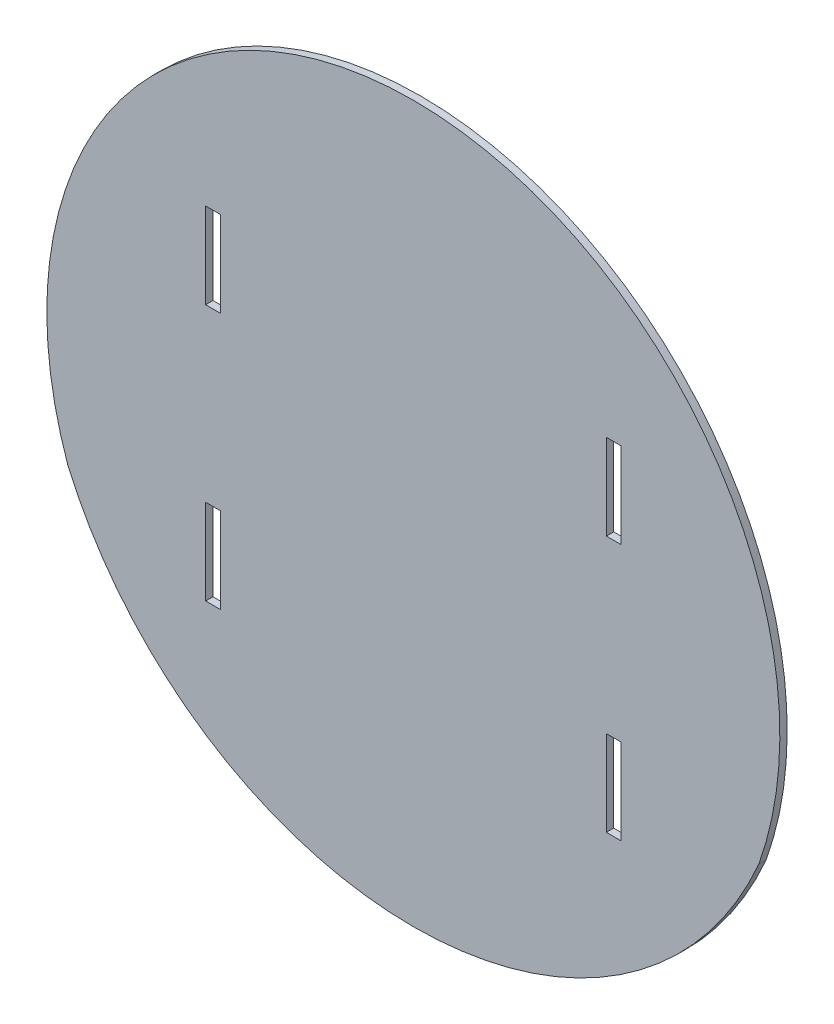
ISO-10303-21;
HEADER;
FILE_DESCRIPTION(('STEP AP214'),'2;1');
FILE_NAME('part.step','',(''),(''),'','','');
FILE_SCHEMA(('AUTOMOTIVE_DESIGN { 1 0 10303 214 1 1 1 1 }'));
ENDSEC;
DATA;
#1=APPLICATION_CONTEXT('core data for automotive mechanical design processes');
#2=APPLICATION_PROTOCOL_DEFINITION('international standard','automotive_design',2000,#1);
#3=PRODUCT_CONTEXT('',#1,'mechanical');
#4=PRODUCT('Part','Part','',(#3));
#5=PRODUCT_RELATED_PRODUCT_CATEGORY('part','',(#4));
#6=PRODUCT_DEFINITION_FORMATION('','',#4);
#7=PRODUCT_DEFINITION_CONTEXT('part definition',#1,'design');
#8=PRODUCT_DEFINITION('design','',#6,#7);
#9=PRODUCT_DEFINITION_SHAPE('','',#8);
#10=(LENGTH_UNIT() NAMED_UNIT(*) SI_UNIT(.MILLI.,.METRE.));
#11=(NAMED_UNIT(*) PLANE_ANGLE_UNIT() SI_UNIT($,.RADIAN.));
#12=(NAMED_UNIT(*) SI_UNIT($,.STERADIAN.) SOLID_ANGLE_UNIT());
#13=UNCERTAINTY_MEASURE_WITH_UNIT(LENGTH_MEASURE(1.E-05),#10,'distance_accuracy_value','');
#14=(GEOMETRIC_REPRESENTATION_CONTEXT(3) GLOBAL_UNCERTAINTY_ASSIGNED_CONTEXT((#13)) GLOBAL_UNIT_ASSIGNED_CONTEXT((#10,
#11,#12)) REPRESENTATION_CONTEXT('',''));
#15=CARTESIAN_POINT('',(0.,0.,0.));
#16=DIRECTION('',(0.,0.,1.));
#17=DIRECTION('',(1.,0.,0.));
#18=AXIS2_PLACEMENT_3D('',#15,#16,#17);
#19=CARTESIAN_POINT('',(0.,5.54868131109093,3.));
#20=DIRECTION('',(0.,0.,-1.));
#21=DIRECTION('',(-1.,0.,0.));
#22=AXIS2_PLACEMENT_3D('',#19,#20,#21);
#23=PLANE('',#22);
#24=DIRECTION('',(0.,1.,0.));
#25=VECTOR('',#24,1.);
#26=CARTESIAN_POINT('',(85.0000000000001,-70.,3.));
#27=LINE('',#26,#25);
#28=CARTESIAN_POINT('',(85.0000000000001,-70.,3.));
#29=VERTEX_POINT('',#28);
#30=CARTESIAN_POINT('',(85.0000000000001,-35.,3.));
#31=VERTEX_POINT('',#30);
#32=EDGE_CURVE('E213',#29,#31,#27,.T.);
#33=ORIENTED_EDGE('',*,*,#32,.F.);
#34=DIRECTION('',(1.,0.,0.));
#35=VECTOR('',#34,1.);
#36=CARTESIAN_POINT('',(85.0000000000001,-70.,3.));
#37=LINE('',#36,#35);
#38=CARTESIAN_POINT('',(79.0000000000001,-70.,3.));
#39=VERTEX_POINT('',#38);
#40=EDGE_CURVE('E224',#39,#29,#37,.T.);
#41=ORIENTED_EDGE('',*,*,#40,.F.);
#42=DIRECTION('',(0.,-1.,0.));
#43=VECTOR('',#42,1.);
#44=CARTESIAN_POINT('',(79.0000000000001,-70.,3.));
#45=LINE('',#44,#43);
#46=CARTESIAN_POINT('',(79.0000000000001,-35.,3.));
#47=VERTEX_POINT('',#46);
#48=EDGE_CURVE('E220',#47,#39,#45,.T.);
#49=ORIENTED_EDGE('',*,*,#48,.F.);
#50=DIRECTION('',(-1.,0.,0.));
#51=VECTOR('',#50,1.);
#52=CARTESIAN_POINT('',(85.0000000000001,-35.,3.));
#53=LINE('',#52,#51);
#54=EDGE_CURVE('E216',#31,#47,#53,.T.);
#55=ORIENTED_EDGE('',*,*,#54,.F.);
#56=EDGE_LOOP('',(#33,#41,#49,#55));
#57=FACE_BOUND('',#56,.T.);
#58=DIRECTION('',(1.,0.,0.));
#59=VECTOR('',#58,1.);
#60=CARTESIAN_POINT('',(-85.,-70.,3.));
#61=LINE('',#60,#59);
#62=CARTESIAN_POINT('',(-85.,-70.,3.));
#63=VERTEX_POINT('',#62);
#64=CARTESIAN_POINT('',(-79.,-70.,3.));
#65=VERTEX_POINT('',#64);
#66=EDGE_CURVE('E299',#63,#65,#61,.T.);
#67=ORIENTED_EDGE('',*,*,#66,.F.);
#68=DIRECTION('',(0.,-1.,0.));
#69=VECTOR('',#68,1.);
#70=CARTESIAN_POINT('',(-85.,-70.,3.));
#71=LINE('',#70,#69);
#72=CARTESIAN_POINT('',(-85.,-35.,3.));
#73=VERTEX_POINT('',#72);
#74=EDGE_CURVE('E310',#73,#63,#71,.T.);
#75=ORIENTED_EDGE('',*,*,#74,.F.);
#76=DIRECTION('',(-1.,0.,0.));
#77=VECTOR('',#76,1.);
#78=CARTESIAN_POINT('',(-85.,-35.,3.));
#79=LINE('',#78,#77);
#80=CARTESIAN_POINT('',(-79.,-35.,3.));
#81=VERTEX_POINT('',#80);
#82=EDGE_CURVE('E306',#81,#73,#79,.T.);
#83=ORIENTED_EDGE('',*,*,#82,.F.);
#84=DIRECTION('',(0.,1.,0.));
#85=VECTOR('',#84,1.);
#86=CARTESIAN_POINT('',(-79.,-70.,3.));
#87=LINE('',#86,#85);
#88=EDGE_CURVE('E302',#65,#81,#87,.T.);
#89=ORIENTED_EDGE('',*,*,#88,.F.);
#90=EDGE_LOOP('',(#67,#75,#83,#89));
#91=FACE_BOUND('',#90,.T.);
#92=CARTESIAN_POINT('',(0.,11.0973626221819,3.));
#93=DIRECTION('',(0.,0.,1.));
#94=DIRECTION('',(-1.,0.,0.));
#95=AXIS2_PLACEMENT_3D('',#92,#93,#94);
#96=CIRCLE('',#95,154.054820500322);
#97=CARTESIAN_POINT('',(-141.42135623731,-49.9999999999998,3.));
#98=VERTEX_POINT('',#97);
#99=CARTESIAN_POINT('',(141.421356237309,-50.,3.));
#100=VERTEX_POINT('',#99);
#101=EDGE_CURVE('E342',#98,#100,#96,.T.);
#102=ORIENTED_EDGE('',*,*,#101,.T.);
#103=CARTESIAN_POINT('',(0.,0.,3.));
#104=DIRECTION('',(0.,0.,1.));
#105=DIRECTION('',(1.,0.,0.));
#106=AXIS2_PLACEMENT_3D('',#103,#104,#105);
#107=CIRCLE('',#106,150.);
#108=EDGE_CURVE('E346',#100,#98,#107,.T.);
#109=ORIENTED_EDGE('',*,*,#108,.T.);
#110=EDGE_LOOP('',(#102,#109));
#111=FACE_BOUND('',#110,.T.);
#112=DIRECTION('',(0.,-1.,0.));
#113=VECTOR('',#112,1.);
#114=CARTESIAN_POINT('',(-85.,35.,3.));
#115=LINE('',#114,#113);
#116=CARTESIAN_POINT('',(-85.,70.,3.));
#117=VERTEX_POINT('',#116);
#118=CARTESIAN_POINT('',(-85.,35.,3.));
#119=VERTEX_POINT('',#118);
#120=EDGE_CURVE('E256',#117,#119,#115,.T.);
#121=ORIENTED_EDGE('',*,*,#120,.F.);
#122=DIRECTION('',(-1.,0.,0.));
#123=VECTOR('',#122,1.);
#124=CARTESIAN_POINT('',(-85.,70.,3.));
#125=LINE('',#124,#123);
#126=CARTESIAN_POINT('',(-79.,70.,3.));
#127=VERTEX_POINT('',#126);
#128=EDGE_CURVE('E267',#127,#117,#125,.T.);
#129=ORIENTED_EDGE('',*,*,#128,.F.);
#130=DIRECTION('',(0.,1.,0.));
#131=VECTOR('',#130,1.);
#132=CARTESIAN_POINT('',(-79.,35.,3.));
#133=LINE('',#132,#131);
#134=CARTESIAN_POINT('',(-79.,35.,3.));
#135=VERTEX_POINT('',#134);
#136=EDGE_CURVE('E263',#135,#127,#133,.T.);
#137=ORIENTED_EDGE('',*,*,#136,.F.);
#138=DIRECTION('',(1.,0.,0.));
#139=VECTOR('',#138,1.);
#140=CARTESIAN_POINT('',(-85.,35.,3.));
#141=LINE('',#140,#139);
#142=EDGE_CURVE('E259',#119,#135,#141,.T.);
#143=ORIENTED_EDGE('',*,*,#142,.F.);
#144=EDGE_LOOP('',(#121,#129,#137,#143));
#145=FACE_BOUND('',#144,.T.);
#146=DIRECTION('',(1.,0.,0.));
#147=VECTOR('',#146,1.);
#148=CARTESIAN_POINT('',(85.,35.,3.));
#149=LINE('',#148,#147);
#150=CARTESIAN_POINT('',(79.,35.,3.));
#151=VERTEX_POINT('',#150);
#152=CARTESIAN_POINT('',(85.,35.,3.));
#153=VERTEX_POINT('',#152);
#154=EDGE_CURVE('E165',#151,#153,#149,.T.);
#155=ORIENTED_EDGE('',*,*,#154,.F.);
#156=DIRECTION('',(0.,-1.,0.));
#157=VECTOR('',#156,1.);
#158=CARTESIAN_POINT('',(79.,35.,3.));
#159=LINE('',#158,#157);
#160=CARTESIAN_POINT('',(79.0000000000001,70.,3.));
#161=VERTEX_POINT('',#160);
#162=EDGE_CURVE('E191',#161,#151,#159,.T.);
#163=ORIENTED_EDGE('',*,*,#162,.F.);
#164=DIRECTION('',(-1.,0.,0.));
#165=VECTOR('',#164,1.);
#166=CARTESIAN_POINT('',(85.0000000000001,70.,3.));
#167=LINE('',#166,#165);
#168=CARTESIAN_POINT('',(85.0000000000001,70.,3.));
#169=VERTEX_POINT('',#168);
#170=EDGE_CURVE('E187',#169,#161,#167,.T.);
#171=ORIENTED_EDGE('',*,*,#170,.F.);
#172=DIRECTION('',(0.,1.,0.));
#173=VECTOR('',#172,1.);
#174=CARTESIAN_POINT('',(85.,35.,3.));
#175=LINE('',#174,#173);
#176=EDGE_CURVE('E174',#153,#169,#175,.T.);
#177=ORIENTED_EDGE('',*,*,#176,.F.);
#178=EDGE_LOOP('',(#155,#163,#171,#177));
#179=FACE_BOUND('',#178,.T.);
#180=ADVANCED_FACE('F39',(#57,#91,#111,#145,#179),#23,.F.);
#181=CARTESIAN_POINT('',(0.,5.54868131109093,0.));
#182=DIRECTION('',(0.,0.,-1.));
#183=DIRECTION('',(-1.,0.,0.));
#184=AXIS2_PLACEMENT_3D('',#181,#182,#183);
#185=PLANE('',#184);
#186=CARTESIAN_POINT('',(0.,11.0973626221819,0.));
#187=DIRECTION('',(0.,0.,1.));
#188=DIRECTION('',(-1.,0.,0.));
#189=AXIS2_PLACEMENT_3D('',#186,#187,#188);
#190=CIRCLE('',#189,154.054820500322);
#191=CARTESIAN_POINT('',(-141.42135623731,-49.9999999999998,0.));
#192=VERTEX_POINT('',#191);
#193=CARTESIAN_POINT('',(141.421356237309,-50.,0.));
#194=VERTEX_POINT('',#193);
#195=EDGE_CURVE('E341',#192,#194,#190,.T.);
#196=ORIENTED_EDGE('',*,*,#195,.F.);
#197=CARTESIAN_POINT('',(0.,0.,0.));
#198=DIRECTION('',(0.,0.,1.));
#199=DIRECTION('',(1.,0.,0.));
#200=AXIS2_PLACEMENT_3D('',#197,#198,#199);
#201=CIRCLE('',#200,150.);
#202=EDGE_CURVE('E347',#194,#192,#201,.T.);
#203=ORIENTED_EDGE('',*,*,#202,.F.);
#204=EDGE_LOOP('',(#196,#203));
#205=FACE_BOUND('',#204,.T.);
#206=DIRECTION('',(0.,-1.,0.));
#207=VECTOR('',#206,1.);
#208=CARTESIAN_POINT('',(-85.,-70.,0.));
#209=LINE('',#208,#207);
#210=CARTESIAN_POINT('',(-85.,-35.,0.));
#211=VERTEX_POINT('',#210);
#212=CARTESIAN_POINT('',(-85.,-70.,0.));
#213=VERTEX_POINT('',#212);
#214=EDGE_CURVE('E303',#211,#213,#209,.T.);
#215=ORIENTED_EDGE('',*,*,#214,.T.);
#216=DIRECTION('',(1.,0.,0.));
#217=VECTOR('',#216,1.);
#218=CARTESIAN_POINT('',(-85.,-70.,0.));
#219=LINE('',#218,#217);
#220=CARTESIAN_POINT('',(-79.,-70.,0.));
#221=VERTEX_POINT('',#220);
#222=EDGE_CURVE('E298',#213,#221,#219,.T.);
#223=ORIENTED_EDGE('',*,*,#222,.T.);
#224=DIRECTION('',(0.,1.,0.));
#225=VECTOR('',#224,1.);
#226=CARTESIAN_POINT('',(-79.,-70.,0.));
#227=LINE('',#226,#225);
#228=CARTESIAN_POINT('',(-79.,-35.,0.));
#229=VERTEX_POINT('',#228);
#230=EDGE_CURVE('E317',#221,#229,#227,.T.);
#231=ORIENTED_EDGE('',*,*,#230,.T.);
#232=DIRECTION('',(-1.,0.,0.));
#233=VECTOR('',#232,1.);
#234=CARTESIAN_POINT('',(-85.,-35.,0.));
#235=LINE('',#234,#233);
#236=EDGE_CURVE('E321',#229,#211,#235,.T.);
#237=ORIENTED_EDGE('',*,*,#236,.T.);
#238=EDGE_LOOP('',(#215,#223,#231,#237));
#239=FACE_BOUND('',#238,.T.);
#240=DIRECTION('',(-1.,0.,0.));
#241=VECTOR('',#240,1.);
#242=CARTESIAN_POINT('',(-85.,70.,0.));
#243=LINE('',#242,#241);
#244=CARTESIAN_POINT('',(-79.,70.,0.));
#245=VERTEX_POINT('',#244);
#246=CARTESIAN_POINT('',(-85.,70.,0.));
#247=VERTEX_POINT('',#246);
#248=EDGE_CURVE('E260',#245,#247,#243,.T.);
#249=ORIENTED_EDGE('',*,*,#248,.T.);
#250=DIRECTION('',(0.,-1.,0.));
#251=VECTOR('',#250,1.);
#252=CARTESIAN_POINT('',(-85.,35.,0.));
#253=LINE('',#252,#251);
#254=CARTESIAN_POINT('',(-85.,35.,0.));
#255=VERTEX_POINT('',#254);
#256=EDGE_CURVE('E255',#247,#255,#253,.T.);
#257=ORIENTED_EDGE('',*,*,#256,.T.);
#258=DIRECTION('',(1.,0.,0.));
#259=VECTOR('',#258,1.);
#260=CARTESIAN_POINT('',(-85.,35.,0.));
#261=LINE('',#260,#259);
#262=CARTESIAN_POINT('',(-79.,35.,0.));
#263=VERTEX_POINT('',#262);
#264=EDGE_CURVE('E274',#255,#263,#261,.T.);
#265=ORIENTED_EDGE('',*,*,#264,.T.);
#266=DIRECTION('',(0.,1.,0.));
#267=VECTOR('',#266,1.);
#268=CARTESIAN_POINT('',(-79.,35.,0.));
#269=LINE('',#268,#267);
#270=EDGE_CURVE('E278',#263,#245,#269,.T.);
#271=ORIENTED_EDGE('',*,*,#270,.T.);
#272=EDGE_LOOP('',(#249,#257,#265,#271));
#273=FACE_BOUND('',#272,.T.);
#274=DIRECTION('',(1.,0.,0.));
#275=VECTOR('',#274,1.);
#276=CARTESIAN_POINT('',(85.0000000000001,-70.,0.));
#277=LINE('',#276,#275);
#278=CARTESIAN_POINT('',(79.0000000000001,-70.,0.));
#279=VERTEX_POINT('',#278);
#280=CARTESIAN_POINT('',(85.0000000000001,-70.,0.));
#281=VERTEX_POINT('',#280);
#282=EDGE_CURVE('E217',#279,#281,#277,.T.);
#283=ORIENTED_EDGE('',*,*,#282,.T.);
#284=DIRECTION('',(0.,1.,0.));
#285=VECTOR('',#284,1.);
#286=CARTESIAN_POINT('',(85.0000000000001,-70.,0.));
#287=LINE('',#286,#285);
#288=CARTESIAN_POINT('',(85.0000000000001,-35.,0.));
#289=VERTEX_POINT('',#288);
#290=EDGE_CURVE('E183',#281,#289,#287,.T.);
#291=ORIENTED_EDGE('',*,*,#290,.T.);
#292=DIRECTION('',(-1.,0.,0.));
#293=VECTOR('',#292,1.);
#294=CARTESIAN_POINT('',(85.0000000000001,-35.,0.));
#295=LINE('',#294,#293);
#296=CARTESIAN_POINT('',(79.0000000000001,-35.,0.));
#297=VERTEX_POINT('',#296);
#298=EDGE_CURVE('E231',#289,#297,#295,.T.);
#299=ORIENTED_EDGE('',*,*,#298,.T.);
#300=DIRECTION('',(0.,-1.,0.));
#301=VECTOR('',#300,1.);
#302=CARTESIAN_POINT('',(79.0000000000001,-70.,0.));
#303=LINE('',#302,#301);
#304=EDGE_CURVE('E235',#297,#279,#303,.T.);
#305=ORIENTED_EDGE('',*,*,#304,.T.);
#306=EDGE_LOOP('',(#283,#291,#299,#305));
#307=FACE_BOUND('',#306,.T.);
#308=DIRECTION('',(0.,-1.,0.));
#309=VECTOR('',#308,1.);
#310=CARTESIAN_POINT('',(79.,35.,0.));
#311=LINE('',#310,#309);
#312=CARTESIAN_POINT('',(79.0000000000001,70.,0.));
#313=VERTEX_POINT('',#312);
#314=CARTESIAN_POINT('',(79.,35.,0.));
#315=VERTEX_POINT('',#314);
#316=EDGE_CURVE('E175',#313,#315,#311,.T.);
#317=ORIENTED_EDGE('',*,*,#316,.T.);
#318=DIRECTION('',(1.,0.,0.));
#319=VECTOR('',#318,1.);
#320=CARTESIAN_POINT('',(85.,35.,0.));
#321=LINE('',#320,#319);
#322=CARTESIAN_POINT('',(85.,35.,0.));
#323=VERTEX_POINT('',#322);
#324=EDGE_CURVE('E63',#315,#323,#321,.T.);
#325=ORIENTED_EDGE('',*,*,#324,.T.);
#326=DIRECTION('',(0.,1.,0.));
#327=VECTOR('',#326,1.);
#328=CARTESIAN_POINT('',(85.,35.,0.));
#329=LINE('',#328,#327);
#330=CARTESIAN_POINT('',(85.0000000000001,70.,0.));
#331=VERTEX_POINT('',#330);
#332=EDGE_CURVE('E181',#323,#331,#329,.T.);
#333=ORIENTED_EDGE('',*,*,#332,.T.);
#334=DIRECTION('',(-1.,0.,0.));
#335=VECTOR('',#334,1.);
#336=CARTESIAN_POINT('',(85.0000000000001,70.,0.));
#337=LINE('',#336,#335);
#338=EDGE_CURVE('E200',#331,#313,#337,.T.);
#339=ORIENTED_EDGE('',*,*,#338,.T.);
#340=EDGE_LOOP('',(#317,#325,#333,#339));
#341=FACE_BOUND('',#340,.T.);
#342=ADVANCED_FACE('F363',(#205,#239,#273,#307,#341),#185,.T.);
#343=CARTESIAN_POINT('',(0.,11.0973626221819,3.));
#344=DIRECTION('',(0.,0.,-1.));
#345=DIRECTION('',(-1.,0.,0.));
#346=AXIS2_PLACEMENT_3D('',#343,#344,#345);
#347=CYLINDRICAL_SURFACE('',#346,154.054820500322);
#348=ORIENTED_EDGE('',*,*,#195,.T.);
#349=DIRECTION('',(0.,0.,-1.));
#350=VECTOR('',#349,1.);
#351=CARTESIAN_POINT('',(141.421356237309,-50.,3.));
#352=LINE('',#351,#350);
#353=EDGE_CURVE('E11',#100,#194,#352,.T.);
#354=ORIENTED_EDGE('',*,*,#353,.F.);
#355=ORIENTED_EDGE('',*,*,#101,.F.);
#356=DIRECTION('',(0.,0.,-1.));
#357=VECTOR('',#356,1.);
#358=CARTESIAN_POINT('',(-141.42135623731,-49.9999999999998,3.));
#359=LINE('',#358,#357);
#360=EDGE_CURVE('E48',#98,#192,#359,.T.);
#361=ORIENTED_EDGE('',*,*,#360,.T.);
#362=EDGE_LOOP('',(#348,#354,#355,#361));
#363=FACE_BOUND('',#362,.T.);
#364=ADVANCED_FACE('F41',(#363),#347,.T.);
#365=CARTESIAN_POINT('',(0.,0.,3.));
#366=DIRECTION('',(0.,0.,-1.));
#367=DIRECTION('',(-1.,0.,0.));
#368=AXIS2_PLACEMENT_3D('',#365,#366,#367);
#369=CYLINDRICAL_SURFACE('',#368,150.);
#370=ORIENTED_EDGE('',*,*,#202,.T.);
#371=ORIENTED_EDGE('',*,*,#360,.F.);
#372=ORIENTED_EDGE('',*,*,#108,.F.);
#373=ORIENTED_EDGE('',*,*,#353,.T.);
#374=EDGE_LOOP('',(#370,#371,#372,#373));
#375=FACE_BOUND('',#374,.T.);
#376=ADVANCED_FACE('F365',(#375),#369,.T.);
#377=CARTESIAN_POINT('',(-85.,-70.,3.));
#378=DIRECTION('',(0.,1.,0.));
#379=DIRECTION('',(-1.,0.,0.));
#380=AXIS2_PLACEMENT_3D('',#377,#378,#379);
#381=PLANE('',#380);
#382=ORIENTED_EDGE('',*,*,#222,.F.);
#383=DIRECTION('',(0.,0.,-1.));
#384=VECTOR('',#383,1.);
#385=CARTESIAN_POINT('',(-85.,-70.,3.));
#386=LINE('',#385,#384);
#387=EDGE_CURVE('E313',#63,#213,#386,.T.);
#388=ORIENTED_EDGE('',*,*,#387,.F.);
#389=ORIENTED_EDGE('',*,*,#66,.T.);
#390=DIRECTION('',(0.,0.,-1.));
#391=VECTOR('',#390,1.);
#392=CARTESIAN_POINT('',(-79.,-70.,3.));
#393=LINE('',#392,#391);
#394=EDGE_CURVE('E337',#65,#221,#393,.T.);
#395=ORIENTED_EDGE('',*,*,#394,.T.);
#396=EDGE_LOOP('',(#382,#388,#389,#395));
#397=FACE_BOUND('',#396,.T.);
#398=ADVANCED_FACE('F414',(#397),#381,.T.);
#399=CARTESIAN_POINT('',(-79.,-70.,3.));
#400=DIRECTION('',(-1.,0.,0.));
#401=DIRECTION('',(0.,0.,1.));
#402=AXIS2_PLACEMENT_3D('',#399,#400,#401);
#403=PLANE('',#402);
#404=ORIENTED_EDGE('',*,*,#230,.F.);
#405=ORIENTED_EDGE('',*,*,#394,.F.);
#406=ORIENTED_EDGE('',*,*,#88,.T.);
#407=DIRECTION('',(0.,0.,-1.));
#408=VECTOR('',#407,1.);
#409=CARTESIAN_POINT('',(-79.,-35.,3.));
#410=LINE('',#409,#408);
#411=EDGE_CURVE('E334',#81,#229,#410,.T.);
#412=ORIENTED_EDGE('',*,*,#411,.T.);
#413=EDGE_LOOP('',(#404,#405,#406,#412));
#414=FACE_BOUND('',#413,.T.);
#415=ADVANCED_FACE('F410',(#414),#403,.T.);
#416=CARTESIAN_POINT('',(-85.,-35.,3.));
#417=DIRECTION('',(0.,-1.,0.));
#418=DIRECTION('',(0.,0.,-1.));
#419=AXIS2_PLACEMENT_3D('',#416,#417,#418);
#420=PLANE('',#419);
#421=ORIENTED_EDGE('',*,*,#236,.F.);
#422=ORIENTED_EDGE('',*,*,#411,.F.);
#423=ORIENTED_EDGE('',*,*,#82,.T.);
#424=DIRECTION('',(0.,0.,-1.));
#425=VECTOR('',#424,1.);
#426=CARTESIAN_POINT('',(-85.,-35.,3.));
#427=LINE('',#426,#425);
#428=EDGE_CURVE('E331',#73,#211,#427,.T.);
#429=ORIENTED_EDGE('',*,*,#428,.T.);
#430=EDGE_LOOP('',(#421,#422,#423,#429));
#431=FACE_BOUND('',#430,.T.);
#432=ADVANCED_FACE('F406',(#431),#420,.T.);
#433=CARTESIAN_POINT('',(-85.,-70.,3.));
#434=DIRECTION('',(1.,0.,0.));
#435=DIRECTION('',(0.,0.,-1.));
#436=AXIS2_PLACEMENT_3D('',#433,#434,#435);
#437=PLANE('',#436);
#438=ORIENTED_EDGE('',*,*,#214,.F.);
#439=ORIENTED_EDGE('',*,*,#428,.F.);
#440=ORIENTED_EDGE('',*,*,#74,.T.);
#441=ORIENTED_EDGE('',*,*,#387,.T.);
#442=EDGE_LOOP('',(#438,#439,#440,#441));
#443=FACE_BOUND('',#442,.T.);
#444=ADVANCED_FACE('F403',(#443),#437,.T.);
#445=CARTESIAN_POINT('',(-85.,35.,3.));
#446=DIRECTION('',(1.,0.,0.));
#447=DIRECTION('',(0.,1.,0.));
#448=AXIS2_PLACEMENT_3D('',#445,#446,#447);
#449=PLANE('',#448);
#450=ORIENTED_EDGE('',*,*,#256,.F.);
#451=DIRECTION('',(0.,0.,-1.));
#452=VECTOR('',#451,1.);
#453=CARTESIAN_POINT('',(-85.,70.,3.));
#454=LINE('',#453,#452);
#455=EDGE_CURVE('E270',#117,#247,#454,.T.);
#456=ORIENTED_EDGE('',*,*,#455,.F.);
#457=ORIENTED_EDGE('',*,*,#120,.T.);
#458=DIRECTION('',(0.,0.,-1.));
#459=VECTOR('',#458,1.);
#460=CARTESIAN_POINT('',(-85.,35.,3.));
#461=LINE('',#460,#459);
#462=EDGE_CURVE('E294',#119,#255,#461,.T.);
#463=ORIENTED_EDGE('',*,*,#462,.T.);
#464=EDGE_LOOP('',(#450,#456,#457,#463));
#465=FACE_BOUND('',#464,.T.);
#466=ADVANCED_FACE('F378',(#465),#449,.T.);
#467=CARTESIAN_POINT('',(-85.,35.,3.));
#468=DIRECTION('',(0.,1.,0.));
#469=DIRECTION('',(0.,0.,1.));
#470=AXIS2_PLACEMENT_3D('',#467,#468,#469);
#471=PLANE('',#470);
#472=ORIENTED_EDGE('',*,*,#264,.F.);
#473=ORIENTED_EDGE('',*,*,#462,.F.);
#474=ORIENTED_EDGE('',*,*,#142,.T.);
#475=DIRECTION('',(0.,0.,-1.));
#476=VECTOR('',#475,1.);
#477=CARTESIAN_POINT('',(-79.,35.,3.));
#478=LINE('',#477,#476);
#479=EDGE_CURVE('E291',#135,#263,#478,.T.);
#480=ORIENTED_EDGE('',*,*,#479,.T.);
#481=EDGE_LOOP('',(#472,#473,#474,#480));
#482=FACE_BOUND('',#481,.T.);
#483=ADVANCED_FACE('F380',(#482),#471,.T.);
#484=CARTESIAN_POINT('',(-79.,35.,3.));
#485=DIRECTION('',(-1.,0.,0.));
#486=DIRECTION('',(0.,-1.,0.));
#487=AXIS2_PLACEMENT_3D('',#484,#485,#486);
#488=PLANE('',#487);
#489=ORIENTED_EDGE('',*,*,#270,.F.);
#490=ORIENTED_EDGE('',*,*,#479,.F.);
#491=ORIENTED_EDGE('',*,*,#136,.T.);
#492=DIRECTION('',(0.,0.,-1.));
#493=VECTOR('',#492,1.);
#494=CARTESIAN_POINT('',(-79.,70.,3.));
#495=LINE('',#494,#493);
#496=EDGE_CURVE('E288',#127,#245,#495,.T.);
#497=ORIENTED_EDGE('',*,*,#496,.T.);
#498=EDGE_LOOP('',(#489,#490,#491,#497));
#499=FACE_BOUND('',#498,.T.);
#500=ADVANCED_FACE('F389',(#499),#488,.T.);
#501=CARTESIAN_POINT('',(-85.,70.,3.));
#502=DIRECTION('',(0.,-1.,0.));
#503=DIRECTION('',(1.,0.,0.));
#504=AXIS2_PLACEMENT_3D('',#501,#502,#503);
#505=PLANE('',#504);
#506=ORIENTED_EDGE('',*,*,#248,.F.);
#507=ORIENTED_EDGE('',*,*,#496,.F.);
#508=ORIENTED_EDGE('',*,*,#128,.T.);
#509=ORIENTED_EDGE('',*,*,#455,.T.);
#510=EDGE_LOOP('',(#506,#507,#508,#509));
#511=FACE_BOUND('',#510,.T.);
#512=ADVANCED_FACE('F387',(#511),#505,.T.);
#513=CARTESIAN_POINT('',(85.0000000000001,-70.,3.));
#514=DIRECTION('',(-1.,0.,0.));
#515=DIRECTION('',(0.,0.,1.));
#516=AXIS2_PLACEMENT_3D('',#513,#514,#515);
#517=PLANE('',#516);
#518=ORIENTED_EDGE('',*,*,#290,.F.);
#519=DIRECTION('',(0.,0.,-1.));
#520=VECTOR('',#519,1.);
#521=CARTESIAN_POINT('',(85.0000000000001,-70.,3.));
#522=LINE('',#521,#520);
#523=EDGE_CURVE('E227',#29,#281,#522,.T.);
#524=ORIENTED_EDGE('',*,*,#523,.F.);
#525=ORIENTED_EDGE('',*,*,#32,.T.);
#526=DIRECTION('',(0.,0.,-1.));
#527=VECTOR('',#526,1.);
#528=CARTESIAN_POINT('',(85.0000000000001,-35.,3.));
#529=LINE('',#528,#527);
#530=EDGE_CURVE('E251',#31,#289,#529,.T.);
#531=ORIENTED_EDGE('',*,*,#530,.T.);
#532=EDGE_LOOP('',(#518,#524,#525,#531));
#533=FACE_BOUND('',#532,.T.);
#534=ADVANCED_FACE('F396',(#533),#517,.T.);
#535=CARTESIAN_POINT('',(85.0000000000001,-35.,3.));
#536=DIRECTION('',(0.,-1.,0.));
#537=DIRECTION('',(0.,0.,-1.));
#538=AXIS2_PLACEMENT_3D('',#535,#536,#537);
#539=PLANE('',#538);
#540=ORIENTED_EDGE('',*,*,#298,.F.);
#541=ORIENTED_EDGE('',*,*,#530,.F.);
#542=ORIENTED_EDGE('',*,*,#54,.T.);
#543=DIRECTION('',(0.,0.,-1.));
#544=VECTOR('',#543,1.);
#545=CARTESIAN_POINT('',(79.0000000000001,-35.,3.));
#546=LINE('',#545,#544);
#547=EDGE_CURVE('E248',#47,#297,#546,.T.);
#548=ORIENTED_EDGE('',*,*,#547,.T.);
#549=EDGE_LOOP('',(#540,#541,#542,#548));
#550=FACE_BOUND('',#549,.T.);
#551=ADVANCED_FACE('F491',(#550),#539,.T.);
#552=CARTESIAN_POINT('',(79.0000000000001,-70.,3.));
#553=DIRECTION('',(1.,0.,0.));
#554=DIRECTION('',(0.,0.,-1.));
#555=AXIS2_PLACEMENT_3D('',#552,#553,#554);
#556=PLANE('',#555);
#557=ORIENTED_EDGE('',*,*,#304,.F.);
#558=ORIENTED_EDGE('',*,*,#547,.F.);
#559=ORIENTED_EDGE('',*,*,#48,.T.);
#560=DIRECTION('',(0.,0.,-1.));
#561=VECTOR('',#560,1.);
#562=CARTESIAN_POINT('',(79.0000000000001,-70.,3.));
#563=LINE('',#562,#561);
#564=EDGE_CURVE('E245',#39,#279,#563,.T.);
#565=ORIENTED_EDGE('',*,*,#564,.T.);
#566=EDGE_LOOP('',(#557,#558,#559,#565));
#567=FACE_BOUND('',#566,.T.);
#568=ADVANCED_FACE('F499',(#567),#556,.T.);
#569=CARTESIAN_POINT('',(85.0000000000001,-70.,3.));
#570=DIRECTION('',(0.,1.,0.));
#571=DIRECTION('',(-1.,0.,0.));
#572=AXIS2_PLACEMENT_3D('',#569,#570,#571);
#573=PLANE('',#572);
#574=ORIENTED_EDGE('',*,*,#282,.F.);
#575=ORIENTED_EDGE('',*,*,#564,.F.);
#576=ORIENTED_EDGE('',*,*,#40,.T.);
#577=ORIENTED_EDGE('',*,*,#523,.T.);
#578=EDGE_LOOP('',(#574,#575,#576,#577));
#579=FACE_BOUND('',#578,.T.);
#580=ADVANCED_FACE('F508',(#579),#573,.T.);
#581=CARTESIAN_POINT('',(85.,35.,3.));
#582=DIRECTION('',(0.,1.,0.));
#583=DIRECTION('',(0.,0.,1.));
#584=AXIS2_PLACEMENT_3D('',#581,#582,#583);
#585=PLANE('',#584);
#586=ORIENTED_EDGE('',*,*,#324,.F.);
#587=DIRECTION('',(0.,0.,-1.));
#588=VECTOR('',#587,1.);
#589=CARTESIAN_POINT('',(79.,35.,3.));
#590=LINE('',#589,#588);
#591=EDGE_CURVE('E169',#151,#315,#590,.T.);
#592=ORIENTED_EDGE('',*,*,#591,.F.);
#593=ORIENTED_EDGE('',*,*,#154,.T.);
#594=DIRECTION('',(0.,0.,-1.));
#595=VECTOR('',#594,1.);
#596=CARTESIAN_POINT('',(85.,35.,3.));
#597=LINE('',#596,#595);
#598=EDGE_CURVE('E168',#153,#323,#597,.T.);
#599=ORIENTED_EDGE('',*,*,#598,.T.);
#600=EDGE_LOOP('',(#586,#592,#593,#599));
#601=FACE_BOUND('',#600,.T.);
#602=ADVANCED_FACE('F167',(#601),#585,.T.);
#603=CARTESIAN_POINT('',(85.,35.,3.));
#604=DIRECTION('',(-1.,0.,0.));
#605=DIRECTION('',(0.,-1.,0.));
#606=AXIS2_PLACEMENT_3D('',#603,#604,#605);
#607=PLANE('',#606);
#608=ORIENTED_EDGE('',*,*,#332,.F.);
#609=ORIENTED_EDGE('',*,*,#598,.F.);
#610=ORIENTED_EDGE('',*,*,#176,.T.);
#611=DIRECTION('',(0.,0.,-1.));
#612=VECTOR('',#611,1.);
#613=CARTESIAN_POINT('',(85.0000000000001,70.,3.));
#614=LINE('',#613,#612);
#615=EDGE_CURVE('E184',#169,#331,#614,.T.);
#616=ORIENTED_EDGE('',*,*,#615,.T.);
#617=EDGE_LOOP('',(#608,#609,#610,#616));
#618=FACE_BOUND('',#617,.T.);
#619=ADVANCED_FACE('F178',(#618),#607,.T.);
#620=CARTESIAN_POINT('',(85.0000000000001,70.,3.));
#621=DIRECTION('',(0.,-1.,0.));
#622=DIRECTION('',(1.,0.,0.));
#623=AXIS2_PLACEMENT_3D('',#620,#621,#622);
#624=PLANE('',#623);
#625=ORIENTED_EDGE('',*,*,#338,.F.);
#626=ORIENTED_EDGE('',*,*,#615,.F.);
#627=ORIENTED_EDGE('',*,*,#170,.T.);
#628=DIRECTION('',(0.,0.,-1.));
#629=VECTOR('',#628,1.);
#630=CARTESIAN_POINT('',(79.0000000000001,70.,3.));
#631=LINE('',#630,#629);
#632=EDGE_CURVE('E55',#161,#313,#631,.T.);
#633=ORIENTED_EDGE('',*,*,#632,.T.);
#634=EDGE_LOOP('',(#625,#626,#627,#633));
#635=FACE_BOUND('',#634,.T.);
#636=ADVANCED_FACE('F532',(#635),#624,.T.);
#637=CARTESIAN_POINT('',(79.,35.,3.));
#638=DIRECTION('',(1.,0.,0.));
#639=DIRECTION('',(0.,1.,0.));
#640=AXIS2_PLACEMENT_3D('',#637,#638,#639);
#641=PLANE('',#640);
#642=ORIENTED_EDGE('',*,*,#316,.F.);
#643=ORIENTED_EDGE('',*,*,#632,.F.);
#644=ORIENTED_EDGE('',*,*,#162,.T.);
#645=ORIENTED_EDGE('',*,*,#591,.T.);
#646=EDGE_LOOP('',(#642,#643,#644,#645));
#647=FACE_BOUND('',#646,.T.);
#648=ADVANCED_FACE('F540',(#647),#641,.T.);
#649=CLOSED_SHELL('',(#180,#342,#364,#376,#398,#415,#432,#444,#466,#483,#500,#512,#534,#551,
#568,#580,#602,#619,#636,#648));
#650=MANIFOLD_SOLID_BREP('B2',#649);
#651=ADVANCED_BREP_SHAPE_REPRESENTATION('',(#18,#650),#14);
#652=SHAPE_DEFINITION_REPRESENTATION(#9,#651);
ENDSEC;
END-ISO-10303-21;
